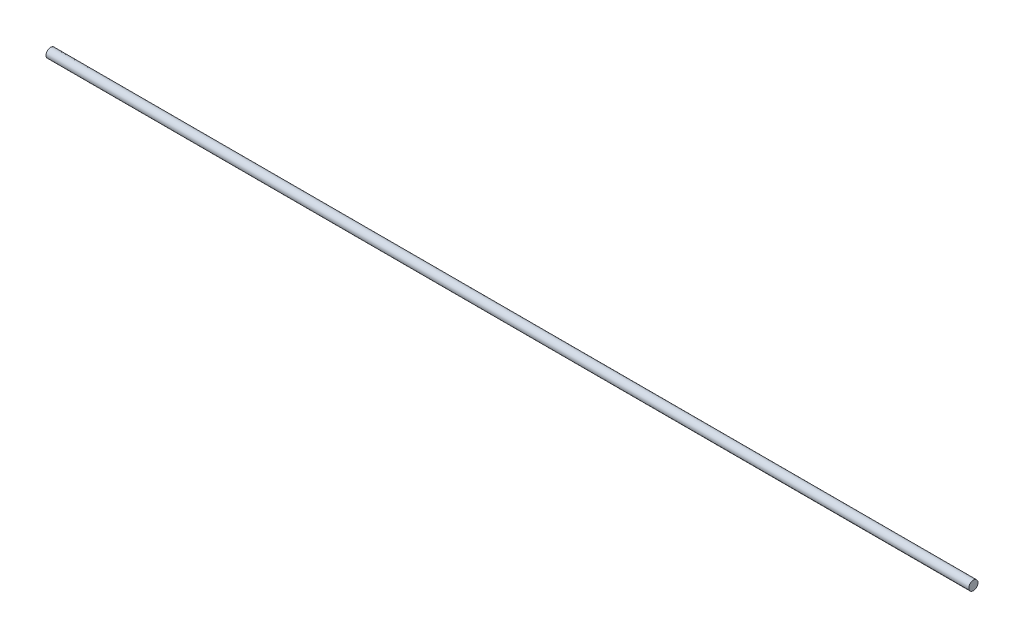
ISO-10303-21;
HEADER;
FILE_DESCRIPTION(('STEP AP214'),'2;1');
FILE_NAME('part.step','',(''),(''),'','','');
FILE_SCHEMA(('AUTOMOTIVE_DESIGN { 1 0 10303 214 1 1 1 1 }'));
ENDSEC;
DATA;
#1=APPLICATION_CONTEXT('core data for automotive mechanical design processes');
#2=APPLICATION_PROTOCOL_DEFINITION('international standard','automotive_design',2000,#1);
#3=PRODUCT_CONTEXT('',#1,'mechanical');
#4=PRODUCT('Part','Part','',(#3));
#5=PRODUCT_RELATED_PRODUCT_CATEGORY('part','',(#4));
#6=PRODUCT_DEFINITION_FORMATION('','',#4);
#7=PRODUCT_DEFINITION_CONTEXT('part definition',#1,'design');
#8=PRODUCT_DEFINITION('design','',#6,#7);
#9=PRODUCT_DEFINITION_SHAPE('','',#8);
#10=(LENGTH_UNIT() NAMED_UNIT(*) SI_UNIT(.MILLI.,.METRE.));
#11=(NAMED_UNIT(*) PLANE_ANGLE_UNIT() SI_UNIT($,.RADIAN.));
#12=(NAMED_UNIT(*) SI_UNIT($,.STERADIAN.) SOLID_ANGLE_UNIT());
#13=UNCERTAINTY_MEASURE_WITH_UNIT(LENGTH_MEASURE(1.E-05),#10,'distance_accuracy_value','');
#14=(GEOMETRIC_REPRESENTATION_CONTEXT(3) GLOBAL_UNCERTAINTY_ASSIGNED_CONTEXT((#13)) GLOBAL_UNIT_ASSIGNED_CONTEXT((#10,
#11,#12)) REPRESENTATION_CONTEXT('',''));
#15=CARTESIAN_POINT('',(0.,0.,0.));
#16=DIRECTION('',(0.,0.,1.));
#17=DIRECTION('',(1.,0.,0.));
#18=AXIS2_PLACEMENT_3D('',#15,#16,#17);
#19=CARTESIAN_POINT('',(800.,0.,0.));
#20=DIRECTION('',(-1.,0.,0.));
#21=DIRECTION('',(0.,0.,1.));
#22=AXIS2_PLACEMENT_3D('',#19,#20,#21);
#23=CYLINDRICAL_SURFACE('',#22,4.);
#24=CARTESIAN_POINT('',(800.,0.,0.));
#25=DIRECTION('',(1.,0.,0.));
#26=DIRECTION('',(0.,0.,-1.));
#27=AXIS2_PLACEMENT_3D('',#24,#25,#26);
#28=CIRCLE('',#27,4.);
#29=CARTESIAN_POINT('',(800.,0.,-4.));
#30=VERTEX_POINT('',#29);
#31=EDGE_CURVE('E10',#30,#30,#28,.T.);
#32=ORIENTED_EDGE('',*,*,#31,.F.);
#33=EDGE_LOOP('',(#32));
#34=FACE_BOUND('',#33,.T.);
#35=CARTESIAN_POINT('',(0.,0.,0.));
#36=DIRECTION('',(1.,0.,0.));
#37=DIRECTION('',(0.,0.,-1.));
#38=AXIS2_PLACEMENT_3D('',#35,#36,#37);
#39=CIRCLE('',#38,4.);
#40=CARTESIAN_POINT('',(0.,0.,-4.));
#41=VERTEX_POINT('',#40);
#42=EDGE_CURVE('E40',#41,#41,#39,.T.);
#43=ORIENTED_EDGE('',*,*,#42,.T.);
#44=EDGE_LOOP('',(#43));
#45=FACE_BOUND('',#44,.T.);
#46=ADVANCED_FACE('F37',(#34,#45),#23,.T.);
#47=CARTESIAN_POINT('',(800.,0.,0.));
#48=DIRECTION('',(1.,0.,0.));
#49=DIRECTION('',(0.,0.,-1.));
#50=AXIS2_PLACEMENT_3D('',#47,#48,#49);
#51=PLANE('',#50);
#52=ORIENTED_EDGE('',*,*,#31,.T.);
#53=EDGE_LOOP('',(#52));
#54=FACE_BOUND('',#53,.T.);
#55=ADVANCED_FACE('F54',(#54),#51,.T.);
#56=CARTESIAN_POINT('',(0.,0.,0.));
#57=DIRECTION('',(1.,0.,0.));
#58=DIRECTION('',(0.,0.,-1.));
#59=AXIS2_PLACEMENT_3D('',#56,#57,#58);
#60=PLANE('',#59);
#61=ORIENTED_EDGE('',*,*,#42,.F.);
#62=EDGE_LOOP('',(#61));
#63=FACE_BOUND('',#62,.T.);
#64=ADVANCED_FACE('F52',(#63),#60,.F.);
#65=CLOSED_SHELL('',(#46,#55,#64));
#66=MANIFOLD_SOLID_BREP('B2',#65);
#67=ADVANCED_BREP_SHAPE_REPRESENTATION('',(#18,#66),#14);
#68=SHAPE_DEFINITION_REPRESENTATION(#9,#67);
ENDSEC;
END-ISO-10303-21;
